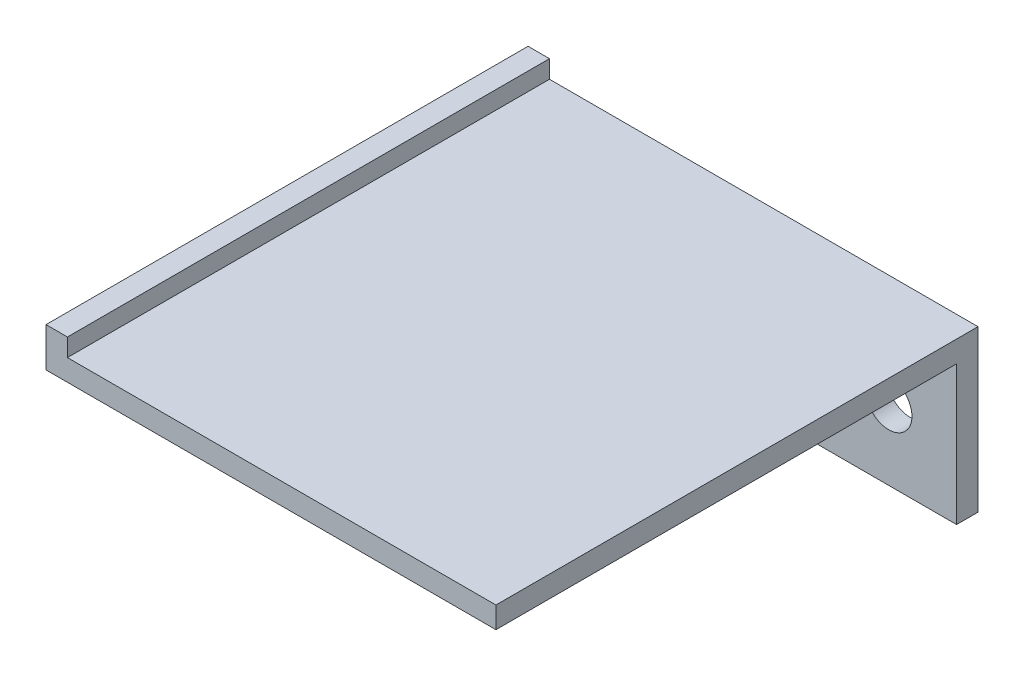
ISO-10303-21;
HEADER;
FILE_DESCRIPTION(('STEP AP214'),'2;1');
FILE_NAME('part.step','',(''),(''),'','','');
FILE_SCHEMA(('AUTOMOTIVE_DESIGN { 1 0 10303 214 1 1 1 1 }'));
ENDSEC;
DATA;
#1=APPLICATION_CONTEXT('core data for automotive mechanical design processes');
#2=APPLICATION_PROTOCOL_DEFINITION('international standard','automotive_design',2000,#1);
#3=PRODUCT_CONTEXT('',#1,'mechanical');
#4=PRODUCT('Part','Part','',(#3));
#5=PRODUCT_RELATED_PRODUCT_CATEGORY('part','',(#4));
#6=PRODUCT_DEFINITION_FORMATION('','',#4);
#7=PRODUCT_DEFINITION_CONTEXT('part definition',#1,'design');
#8=PRODUCT_DEFINITION('design','',#6,#7);
#9=PRODUCT_DEFINITION_SHAPE('','',#8);
#10=(LENGTH_UNIT() NAMED_UNIT(*) SI_UNIT(.MILLI.,.METRE.));
#11=(NAMED_UNIT(*) PLANE_ANGLE_UNIT() SI_UNIT($,.RADIAN.));
#12=(NAMED_UNIT(*) SI_UNIT($,.STERADIAN.) SOLID_ANGLE_UNIT());
#13=UNCERTAINTY_MEASURE_WITH_UNIT(LENGTH_MEASURE(1.E-05),#10,'distance_accuracy_value','');
#14=(GEOMETRIC_REPRESENTATION_CONTEXT(3) GLOBAL_UNCERTAINTY_ASSIGNED_CONTEXT((#13)) GLOBAL_UNIT_ASSIGNED_CONTEXT((#10,
#11,#12)) REPRESENTATION_CONTEXT('',''));
#15=CARTESIAN_POINT('',(0.,0.,0.));
#16=DIRECTION('',(0.,0.,1.));
#17=DIRECTION('',(1.,0.,0.));
#18=AXIS2_PLACEMENT_3D('',#15,#16,#17);
#19=CARTESIAN_POINT('',(0.,0.,0.));
#20=DIRECTION('',(0.,-1.,0.));
#21=DIRECTION('',(0.,0.,-1.));
#22=AXIS2_PLACEMENT_3D('',#19,#20,#21);
#23=PLANE('',#22);
#24=DIRECTION('',(0.,0.,1.));
#25=VECTOR('',#24,1.);
#26=CARTESIAN_POINT('',(0.,0.,0.));
#27=LINE('',#26,#25);
#28=CARTESIAN_POINT('',(0.,0.,-258.));
#29=VERTEX_POINT('',#28);
#30=CARTESIAN_POINT('',(0.,0.,0.));
#31=VERTEX_POINT('',#30);
#32=EDGE_CURVE('E38',#29,#31,#27,.T.);
#33=ORIENTED_EDGE('',*,*,#32,.F.);
#34=DIRECTION('',(-1.,0.,0.));
#35=VECTOR('',#34,1.);
#36=CARTESIAN_POINT('',(240.,0.,-258.));
#37=LINE('',#36,#35);
#38=CARTESIAN_POINT('',(240.,0.,-258.));
#39=VERTEX_POINT('',#38);
#40=EDGE_CURVE('E150',#39,#29,#37,.T.);
#41=ORIENTED_EDGE('',*,*,#40,.F.);
#42=DIRECTION('',(0.,0.,-1.));
#43=VECTOR('',#42,1.);
#44=CARTESIAN_POINT('',(240.,0.,0.));
#45=LINE('',#44,#43);
#46=CARTESIAN_POINT('',(240.,0.,0.));
#47=VERTEX_POINT('',#46);
#48=EDGE_CURVE('E174',#47,#39,#45,.T.);
#49=ORIENTED_EDGE('',*,*,#48,.F.);
#50=DIRECTION('',(1.,0.,0.));
#51=VECTOR('',#50,1.);
#52=CARTESIAN_POINT('',(0.,0.,0.));
#53=LINE('',#52,#51);
#54=EDGE_CURVE('E169',#31,#47,#53,.T.);
#55=ORIENTED_EDGE('',*,*,#54,.F.);
#56=EDGE_LOOP('',(#33,#41,#49,#55));
#57=FACE_BOUND('',#56,.T.);
#58=ADVANCED_FACE('F34',(#57),#23,.T.);
#59=CARTESIAN_POINT('',(0.,0.,0.));
#60=DIRECTION('',(-1.,0.,0.));
#61=DIRECTION('',(0.,0.,1.));
#62=AXIS2_PLACEMENT_3D('',#59,#60,#61);
#63=PLANE('',#62);
#64=CARTESIAN_POINT('',(0.,-38.,-137.));
#65=DIRECTION('',(-1.,0.,0.));
#66=DIRECTION('',(0.,0.,1.));
#67=AXIS2_PLACEMENT_3D('',#64,#65,#66);
#68=CIRCLE('',#67,13.);
#69=CARTESIAN_POINT('',(0.,-38.,-124.));
#70=VERTEX_POINT('',#69);
#71=EDGE_CURVE('E240',#70,#70,#68,.T.);
#72=ORIENTED_EDGE('',*,*,#71,.T.);
#73=EDGE_LOOP('',(#72));
#74=FACE_BOUND('',#73,.T.);
#75=CARTESIAN_POINT('',(0.,-38.,-217.));
#76=DIRECTION('',(-1.,0.,0.));
#77=DIRECTION('',(0.,0.,1.));
#78=AXIS2_PLACEMENT_3D('',#75,#76,#77);
#79=CIRCLE('',#78,13.);
#80=CARTESIAN_POINT('',(0.,-38.,-204.));
#81=VERTEX_POINT('',#80);
#82=EDGE_CURVE('E234',#81,#81,#79,.T.);
#83=ORIENTED_EDGE('',*,*,#82,.T.);
#84=EDGE_LOOP('',(#83));
#85=FACE_BOUND('',#84,.T.);
#86=ORIENTED_EDGE('',*,*,#32,.T.);
#87=DIRECTION('',(0.,-0.615031798693877,-0.788502306017791));
#88=VECTOR('',#87,1.);
#89=CARTESIAN_POINT('',(0.,0.,0.));
#90=LINE('',#89,#88);
#91=CARTESIAN_POINT('',(0.,-78.,-100.));
#92=VERTEX_POINT('',#91);
#93=EDGE_CURVE('E125',#31,#92,#90,.T.);
#94=ORIENTED_EDGE('',*,*,#93,.T.);
#95=DIRECTION('',(0.,0.,1.));
#96=VECTOR('',#95,1.);
#97=CARTESIAN_POINT('',(0.,-78.,-270.));
#98=LINE('',#97,#96);
#99=CARTESIAN_POINT('',(0.,-78.,-258.));
#100=VERTEX_POINT('',#99);
#101=EDGE_CURVE('E124',#100,#92,#98,.T.);
#102=ORIENTED_EDGE('',*,*,#101,.F.);
#103=DIRECTION('',(0.,-1.,0.));
#104=VECTOR('',#103,1.);
#105=CARTESIAN_POINT('',(0.,-78.,-258.));
#106=LINE('',#105,#104);
#107=EDGE_CURVE('E217',#29,#100,#106,.T.);
#108=ORIENTED_EDGE('',*,*,#107,.F.);
#109=EDGE_LOOP('',(#86,#94,#102,#108));
#110=FACE_BOUND('',#109,.T.);
#111=ADVANCED_FACE('F251',(#74,#85,#110),#63,.F.);
#112=CARTESIAN_POINT('',(0.,12.,0.));
#113=DIRECTION('',(0.,0.,-1.));
#114=DIRECTION('',(-1.,0.,0.));
#115=AXIS2_PLACEMENT_3D('',#112,#113,#114);
#116=PLANE('',#115);
#117=DIRECTION('',(0.,1.,0.));
#118=VECTOR('',#117,1.);
#119=CARTESIAN_POINT('',(-12.,22.,0.));
#120=LINE('',#119,#118);
#121=CARTESIAN_POINT('',(-12.,0.,0.));
#122=VERTEX_POINT('',#121);
#123=CARTESIAN_POINT('',(-12.,22.,0.));
#124=VERTEX_POINT('',#123);
#125=EDGE_CURVE('E132',#122,#124,#120,.T.);
#126=ORIENTED_EDGE('',*,*,#125,.F.);
#127=DIRECTION('',(-1.,0.,0.));
#128=VECTOR('',#127,1.);
#129=CARTESIAN_POINT('',(240.000025,0.,0.));
#130=LINE('',#129,#128);
#131=EDGE_CURVE('E52',#31,#122,#130,.T.);
#132=ORIENTED_EDGE('',*,*,#131,.F.);
#133=ORIENTED_EDGE('',*,*,#54,.T.);
#134=DIRECTION('',(0.,-1.,0.));
#135=VECTOR('',#134,1.);
#136=CARTESIAN_POINT('',(240.,12.,0.));
#137=LINE('',#136,#135);
#138=CARTESIAN_POINT('',(240.,12.,0.));
#139=VERTEX_POINT('',#138);
#140=EDGE_CURVE('E11',#139,#47,#137,.T.);
#141=ORIENTED_EDGE('',*,*,#140,.F.);
#142=DIRECTION('',(1.,0.,0.));
#143=VECTOR('',#142,1.);
#144=CARTESIAN_POINT('',(0.,12.,0.));
#145=LINE('',#144,#143);
#146=CARTESIAN_POINT('',(0.,12.,0.));
#147=VERTEX_POINT('',#146);
#148=EDGE_CURVE('E191',#147,#139,#145,.T.);
#149=ORIENTED_EDGE('',*,*,#148,.F.);
#150=DIRECTION('',(0.,1.,0.));
#151=VECTOR('',#150,1.);
#152=CARTESIAN_POINT('',(0.,22.,0.));
#153=LINE('',#152,#151);
#154=CARTESIAN_POINT('',(0.,22.,0.));
#155=VERTEX_POINT('',#154);
#156=EDGE_CURVE('E153',#147,#155,#153,.T.);
#157=ORIENTED_EDGE('',*,*,#156,.T.);
#158=DIRECTION('',(1.,0.,0.));
#159=VECTOR('',#158,1.);
#160=CARTESIAN_POINT('',(-12.,22.,0.));
#161=LINE('',#160,#159);
#162=EDGE_CURVE('E161',#124,#155,#161,.T.);
#163=ORIENTED_EDGE('',*,*,#162,.F.);
#164=EDGE_LOOP('',(#126,#132,#133,#141,#149,#157,#163));
#165=FACE_BOUND('',#164,.T.);
#166=ADVANCED_FACE('F36',(#165),#116,.F.);
#167=CARTESIAN_POINT('',(240.,12.,0.));
#168=DIRECTION('',(-1.,0.,0.));
#169=DIRECTION('',(0.,0.,1.));
#170=AXIS2_PLACEMENT_3D('',#167,#168,#169);
#171=PLANE('',#170);
#172=ORIENTED_EDGE('',*,*,#48,.T.);
#173=DIRECTION('',(0.,-1.,0.));
#174=VECTOR('',#173,1.);
#175=CARTESIAN_POINT('',(240.,-78.,-258.));
#176=LINE('',#175,#174);
#177=CARTESIAN_POINT('',(240.,-78.,-258.));
#178=VERTEX_POINT('',#177);
#179=EDGE_CURVE('E219',#39,#178,#176,.T.);
#180=ORIENTED_EDGE('',*,*,#179,.T.);
#181=DIRECTION('',(0.,0.,-1.));
#182=VECTOR('',#181,1.);
#183=CARTESIAN_POINT('',(240.,-78.,-270.));
#184=LINE('',#183,#182);
#185=CARTESIAN_POINT('',(240.,-78.,-270.));
#186=VERTEX_POINT('',#185);
#187=EDGE_CURVE('E204',#178,#186,#184,.T.);
#188=ORIENTED_EDGE('',*,*,#187,.T.);
#189=DIRECTION('',(0.,-1.,0.));
#190=VECTOR('',#189,1.);
#191=CARTESIAN_POINT('',(240.,12.,-270.));
#192=LINE('',#191,#190);
#193=CARTESIAN_POINT('',(240.,12.,-270.));
#194=VERTEX_POINT('',#193);
#195=EDGE_CURVE('E44',#194,#186,#192,.T.);
#196=ORIENTED_EDGE('',*,*,#195,.F.);
#197=DIRECTION('',(0.,0.,-1.));
#198=VECTOR('',#197,1.);
#199=CARTESIAN_POINT('',(240.,12.,0.));
#200=LINE('',#199,#198);
#201=EDGE_CURVE('E188',#139,#194,#200,.T.);
#202=ORIENTED_EDGE('',*,*,#201,.F.);
#203=ORIENTED_EDGE('',*,*,#140,.T.);
#204=EDGE_LOOP('',(#172,#180,#188,#196,#202,#203));
#205=FACE_BOUND('',#204,.T.);
#206=ADVANCED_FACE('F203',(#205),#171,.F.);
#207=CARTESIAN_POINT('',(0.,12.,-270.));
#208=DIRECTION('',(0.,0.,1.));
#209=DIRECTION('',(1.,0.,0.));
#210=AXIS2_PLACEMENT_3D('',#207,#208,#209);
#211=PLANE('',#210);
#212=CARTESIAN_POINT('',(202.,-38.,-270.));
#213=DIRECTION('',(0.,0.,1.));
#214=DIRECTION('',(1.,0.,0.));
#215=AXIS2_PLACEMENT_3D('',#212,#213,#214);
#216=CIRCLE('',#215,13.);
#217=CARTESIAN_POINT('',(215.,-38.,-270.));
#218=VERTEX_POINT('',#217);
#219=EDGE_CURVE('E228',#218,#218,#216,.T.);
#220=ORIENTED_EDGE('',*,*,#219,.T.);
#221=EDGE_LOOP('',(#220));
#222=FACE_BOUND('',#221,.T.);
#223=CARTESIAN_POINT('',(82.,-38.,-270.));
#224=DIRECTION('',(0.,0.,1.));
#225=DIRECTION('',(1.,0.,0.));
#226=AXIS2_PLACEMENT_3D('',#223,#224,#225);
#227=CIRCLE('',#226,13.);
#228=CARTESIAN_POINT('',(95.,-38.,-270.));
#229=VERTEX_POINT('',#228);
#230=EDGE_CURVE('E220',#229,#229,#227,.T.);
#231=ORIENTED_EDGE('',*,*,#230,.T.);
#232=EDGE_LOOP('',(#231));
#233=FACE_BOUND('',#232,.T.);
#234=ORIENTED_EDGE('',*,*,#195,.T.);
#235=DIRECTION('',(1.,0.,0.));
#236=VECTOR('',#235,1.);
#237=CARTESIAN_POINT('',(-12.,-78.,-270.));
#238=LINE('',#237,#236);
#239=CARTESIAN_POINT('',(-12.,-78.,-270.));
#240=VERTEX_POINT('',#239);
#241=EDGE_CURVE('E151',#240,#186,#238,.T.);
#242=ORIENTED_EDGE('',*,*,#241,.F.);
#243=DIRECTION('',(0.,-1.,0.));
#244=VECTOR('',#243,1.);
#245=CARTESIAN_POINT('',(-12.,22.,-270.));
#246=LINE('',#245,#244);
#247=CARTESIAN_POINT('',(-12.,22.,-270.));
#248=VERTEX_POINT('',#247);
#249=EDGE_CURVE('E130',#248,#240,#246,.T.);
#250=ORIENTED_EDGE('',*,*,#249,.F.);
#251=DIRECTION('',(1.,0.,0.));
#252=VECTOR('',#251,1.);
#253=CARTESIAN_POINT('',(-12.,22.,-270.));
#254=LINE('',#253,#252);
#255=CARTESIAN_POINT('',(0.,22.,-270.));
#256=VERTEX_POINT('',#255);
#257=EDGE_CURVE('E141',#248,#256,#254,.T.);
#258=ORIENTED_EDGE('',*,*,#257,.T.);
#259=DIRECTION('',(0.,-1.,0.));
#260=VECTOR('',#259,1.);
#261=CARTESIAN_POINT('',(0.,22.,-270.));
#262=LINE('',#261,#260);
#263=CARTESIAN_POINT('',(0.,12.,-270.));
#264=VERTEX_POINT('',#263);
#265=EDGE_CURVE('E146',#256,#264,#262,.T.);
#266=ORIENTED_EDGE('',*,*,#265,.T.);
#267=DIRECTION('',(-1.,0.,0.));
#268=VECTOR('',#267,1.);
#269=CARTESIAN_POINT('',(0.,12.,-270.));
#270=LINE('',#269,#268);
#271=EDGE_CURVE('E185',#194,#264,#270,.T.);
#272=ORIENTED_EDGE('',*,*,#271,.F.);
#273=EDGE_LOOP('',(#234,#242,#250,#258,#266,#272));
#274=FACE_BOUND('',#273,.T.);
#275=ADVANCED_FACE('F206',(#222,#233,#274),#211,.F.);
#276=CARTESIAN_POINT('',(0.,12.,0.));
#277=DIRECTION('',(0.,-1.,0.));
#278=DIRECTION('',(0.,0.,-1.));
#279=AXIS2_PLACEMENT_3D('',#276,#277,#278);
#280=PLANE('',#279);
#281=DIRECTION('',(0.,0.,1.));
#282=VECTOR('',#281,1.);
#283=CARTESIAN_POINT('',(0.,12.,0.));
#284=LINE('',#283,#282);
#285=EDGE_CURVE('E179',#264,#147,#284,.T.);
#286=ORIENTED_EDGE('',*,*,#285,.T.);
#287=ORIENTED_EDGE('',*,*,#148,.T.);
#288=ORIENTED_EDGE('',*,*,#201,.T.);
#289=ORIENTED_EDGE('',*,*,#271,.T.);
#290=EDGE_LOOP('',(#286,#287,#288,#289));
#291=FACE_BOUND('',#290,.T.);
#292=ADVANCED_FACE('F199',(#291),#280,.F.);
#293=CARTESIAN_POINT('',(-12.,-78.,-270.));
#294=DIRECTION('',(0.,1.,0.));
#295=DIRECTION('',(0.,0.,1.));
#296=AXIS2_PLACEMENT_3D('',#293,#294,#295);
#297=PLANE('',#296);
#298=ORIENTED_EDGE('',*,*,#101,.T.);
#299=DIRECTION('',(-1.,0.,0.));
#300=VECTOR('',#299,1.);
#301=CARTESIAN_POINT('',(240.000025,-78.,-100.));
#302=LINE('',#301,#300);
#303=CARTESIAN_POINT('',(-12.,-78.,-100.));
#304=VERTEX_POINT('',#303);
#305=EDGE_CURVE('E113',#92,#304,#302,.T.);
#306=ORIENTED_EDGE('',*,*,#305,.T.);
#307=DIRECTION('',(0.,0.,1.));
#308=VECTOR('',#307,1.);
#309=CARTESIAN_POINT('',(-12.,-78.,-270.));
#310=LINE('',#309,#308);
#311=EDGE_CURVE('E121',#240,#304,#310,.T.);
#312=ORIENTED_EDGE('',*,*,#311,.F.);
#313=ORIENTED_EDGE('',*,*,#241,.T.);
#314=ORIENTED_EDGE('',*,*,#187,.F.);
#315=DIRECTION('',(-1.,0.,0.));
#316=VECTOR('',#315,1.);
#317=CARTESIAN_POINT('',(240.,-78.,-258.));
#318=LINE('',#317,#316);
#319=EDGE_CURVE('E60',#178,#100,#318,.T.);
#320=ORIENTED_EDGE('',*,*,#319,.T.);
#321=EDGE_LOOP('',(#298,#306,#312,#313,#314,#320));
#322=FACE_BOUND('',#321,.T.);
#323=ADVANCED_FACE('F119',(#322),#297,.F.);
#324=CARTESIAN_POINT('',(-12.,22.,-270.));
#325=DIRECTION('',(0.,-1.,0.));
#326=DIRECTION('',(0.,0.,-1.));
#327=AXIS2_PLACEMENT_3D('',#324,#325,#326);
#328=PLANE('',#327);
#329=DIRECTION('',(0.,0.,-1.));
#330=VECTOR('',#329,1.);
#331=CARTESIAN_POINT('',(0.,22.,-270.));
#332=LINE('',#331,#330);
#333=EDGE_CURVE('E136',#155,#256,#332,.T.);
#334=ORIENTED_EDGE('',*,*,#333,.T.);
#335=ORIENTED_EDGE('',*,*,#257,.F.);
#336=DIRECTION('',(0.,0.,-1.));
#337=VECTOR('',#336,1.);
#338=CARTESIAN_POINT('',(-12.,22.,-270.));
#339=LINE('',#338,#337);
#340=EDGE_CURVE('E134',#124,#248,#339,.T.);
#341=ORIENTED_EDGE('',*,*,#340,.F.);
#342=ORIENTED_EDGE('',*,*,#162,.T.);
#343=EDGE_LOOP('',(#334,#335,#341,#342));
#344=FACE_BOUND('',#343,.T.);
#345=ADVANCED_FACE('F252',(#344),#328,.F.);
#346=CARTESIAN_POINT('',(-12.,0.,0.));
#347=DIRECTION('',(-1.,0.,0.));
#348=DIRECTION('',(0.,0.,1.));
#349=AXIS2_PLACEMENT_3D('',#346,#347,#348);
#350=PLANE('',#349);
#351=DIRECTION('',(0.,-0.615031798693877,-0.788502306017791));
#352=VECTOR('',#351,1.);
#353=CARTESIAN_POINT('',(-12.,-78.,-100.));
#354=LINE('',#353,#352);
#355=EDGE_CURVE('E110',#122,#304,#354,.T.);
#356=ORIENTED_EDGE('',*,*,#355,.F.);
#357=ORIENTED_EDGE('',*,*,#125,.T.);
#358=ORIENTED_EDGE('',*,*,#340,.T.);
#359=ORIENTED_EDGE('',*,*,#249,.T.);
#360=ORIENTED_EDGE('',*,*,#311,.T.);
#361=EDGE_LOOP('',(#356,#357,#358,#359,#360));
#362=FACE_BOUND('',#361,.T.);
#363=CARTESIAN_POINT('',(-12.,-38.,-137.));
#364=DIRECTION('',(-1.,0.,0.));
#365=DIRECTION('',(0.,0.,1.));
#366=AXIS2_PLACEMENT_3D('',#363,#364,#365);
#367=CIRCLE('',#366,13.);
#368=CARTESIAN_POINT('',(-12.,-38.,-124.));
#369=VERTEX_POINT('',#368);
#370=EDGE_CURVE('E243',#369,#369,#367,.T.);
#371=ORIENTED_EDGE('',*,*,#370,.F.);
#372=EDGE_LOOP('',(#371));
#373=FACE_BOUND('',#372,.T.);
#374=CARTESIAN_POINT('',(-12.,-38.,-217.));
#375=DIRECTION('',(-1.,0.,0.));
#376=DIRECTION('',(0.,0.,1.));
#377=AXIS2_PLACEMENT_3D('',#374,#375,#376);
#378=CIRCLE('',#377,13.);
#379=CARTESIAN_POINT('',(-12.,-38.,-204.));
#380=VERTEX_POINT('',#379);
#381=EDGE_CURVE('E237',#380,#380,#378,.T.);
#382=ORIENTED_EDGE('',*,*,#381,.F.);
#383=EDGE_LOOP('',(#382));
#384=FACE_BOUND('',#383,.T.);
#385=ADVANCED_FACE('F127',(#362,#373,#384),#350,.T.);
#386=ORIENTED_EDGE('',*,*,#285,.F.);
#387=ORIENTED_EDGE('',*,*,#265,.F.);
#388=ORIENTED_EDGE('',*,*,#333,.F.);
#389=ORIENTED_EDGE('',*,*,#156,.F.);
#390=EDGE_LOOP('',(#386,#387,#388,#389));
#391=FACE_BOUND('',#390,.T.);
#392=ADVANCED_FACE('F210',(#391),#63,.F.);
#393=CARTESIAN_POINT('',(240.,-78.,-258.));
#394=DIRECTION('',(0.,0.,-1.));
#395=DIRECTION('',(-1.,0.,0.));
#396=AXIS2_PLACEMENT_3D('',#393,#394,#395);
#397=PLANE('',#396);
#398=CARTESIAN_POINT('',(202.,-38.,-258.));
#399=DIRECTION('',(0.,0.,1.));
#400=DIRECTION('',(1.,0.,0.));
#401=AXIS2_PLACEMENT_3D('',#398,#399,#400);
#402=CIRCLE('',#401,13.);
#403=CARTESIAN_POINT('',(215.,-38.,-258.));
#404=VERTEX_POINT('',#403);
#405=EDGE_CURVE('E231',#404,#404,#402,.T.);
#406=ORIENTED_EDGE('',*,*,#405,.F.);
#407=EDGE_LOOP('',(#406));
#408=FACE_BOUND('',#407,.T.);
#409=CARTESIAN_POINT('',(82.,-38.,-258.));
#410=DIRECTION('',(0.,0.,1.));
#411=DIRECTION('',(1.,0.,0.));
#412=AXIS2_PLACEMENT_3D('',#409,#410,#411);
#413=CIRCLE('',#412,13.);
#414=CARTESIAN_POINT('',(95.,-38.,-258.));
#415=VERTEX_POINT('',#414);
#416=EDGE_CURVE('E225',#415,#415,#413,.T.);
#417=ORIENTED_EDGE('',*,*,#416,.F.);
#418=EDGE_LOOP('',(#417));
#419=FACE_BOUND('',#418,.T.);
#420=ORIENTED_EDGE('',*,*,#107,.T.);
#421=ORIENTED_EDGE('',*,*,#319,.F.);
#422=ORIENTED_EDGE('',*,*,#179,.F.);
#423=ORIENTED_EDGE('',*,*,#40,.T.);
#424=EDGE_LOOP('',(#420,#421,#422,#423));
#425=FACE_BOUND('',#424,.T.);
#426=ADVANCED_FACE('F312',(#408,#419,#425),#397,.F.);
#427=CARTESIAN_POINT('',(82.,-38.,-270.00005));
#428=DIRECTION('',(0.,0.,1.));
#429=DIRECTION('',(1.,0.,0.));
#430=AXIS2_PLACEMENT_3D('',#427,#428,#429);
#431=CYLINDRICAL_SURFACE('',#430,13.);
#432=ORIENTED_EDGE('',*,*,#416,.T.);
#433=EDGE_LOOP('',(#432));
#434=FACE_BOUND('',#433,.T.);
#435=ORIENTED_EDGE('',*,*,#230,.F.);
#436=EDGE_LOOP('',(#435));
#437=FACE_BOUND('',#436,.T.);
#438=ADVANCED_FACE('F300',(#434,#437),#431,.F.);
#439=CARTESIAN_POINT('',(202.,-38.,-270.00005));
#440=DIRECTION('',(0.,0.,1.));
#441=DIRECTION('',(1.,0.,0.));
#442=AXIS2_PLACEMENT_3D('',#439,#440,#441);
#443=CYLINDRICAL_SURFACE('',#442,13.);
#444=ORIENTED_EDGE('',*,*,#405,.T.);
#445=EDGE_LOOP('',(#444));
#446=FACE_BOUND('',#445,.T.);
#447=ORIENTED_EDGE('',*,*,#219,.F.);
#448=EDGE_LOOP('',(#447));
#449=FACE_BOUND('',#448,.T.);
#450=ADVANCED_FACE('F294',(#446,#449),#443,.F.);
#451=CARTESIAN_POINT('',(240.000025,-38.,-217.));
#452=DIRECTION('',(-1.,0.,0.));
#453=DIRECTION('',(0.,0.,1.));
#454=AXIS2_PLACEMENT_3D('',#451,#452,#453);
#455=CYLINDRICAL_SURFACE('',#454,13.);
#456=ORIENTED_EDGE('',*,*,#381,.T.);
#457=EDGE_LOOP('',(#456));
#458=FACE_BOUND('',#457,.T.);
#459=ORIENTED_EDGE('',*,*,#82,.F.);
#460=EDGE_LOOP('',(#459));
#461=FACE_BOUND('',#460,.T.);
#462=ADVANCED_FACE('F299',(#458,#461),#455,.F.);
#463=CARTESIAN_POINT('',(240.000025,-38.,-137.));
#464=DIRECTION('',(-1.,0.,0.));
#465=DIRECTION('',(0.,0.,1.));
#466=AXIS2_PLACEMENT_3D('',#463,#464,#465);
#467=CYLINDRICAL_SURFACE('',#466,13.);
#468=ORIENTED_EDGE('',*,*,#370,.T.);
#469=EDGE_LOOP('',(#468));
#470=FACE_BOUND('',#469,.T.);
#471=ORIENTED_EDGE('',*,*,#71,.F.);
#472=EDGE_LOOP('',(#471));
#473=FACE_BOUND('',#472,.T.);
#474=ADVANCED_FACE('F370',(#470,#473),#467,.F.);
#475=CARTESIAN_POINT('',(240.000025,-78.,-100.));
#476=DIRECTION('',(0.,0.788502306017791,-0.615031798693877));
#477=DIRECTION('',(0.,0.615031798693877,0.788502306017791));
#478=AXIS2_PLACEMENT_3D('',#475,#476,#477);
#479=PLANE('',#478);
#480=ORIENTED_EDGE('',*,*,#131,.T.);
#481=ORIENTED_EDGE('',*,*,#355,.T.);
#482=ORIENTED_EDGE('',*,*,#305,.F.);
#483=ORIENTED_EDGE('',*,*,#93,.F.);
#484=EDGE_LOOP('',(#480,#481,#482,#483));
#485=FACE_BOUND('',#484,.T.);
#486=ADVANCED_FACE('F112',(#485),#479,.F.);
#487=CLOSED_SHELL('',(#58,#111,#166,#206,#275,#292,#323,#345,#385,#392,#426,#438,#450,#462,#474,#486));
#488=MANIFOLD_SOLID_BREP('B2',#487);
#489=ADVANCED_BREP_SHAPE_REPRESENTATION('',(#18,#488),#14);
#490=SHAPE_DEFINITION_REPRESENTATION(#9,#489);
ENDSEC;
END-ISO-10303-21;
